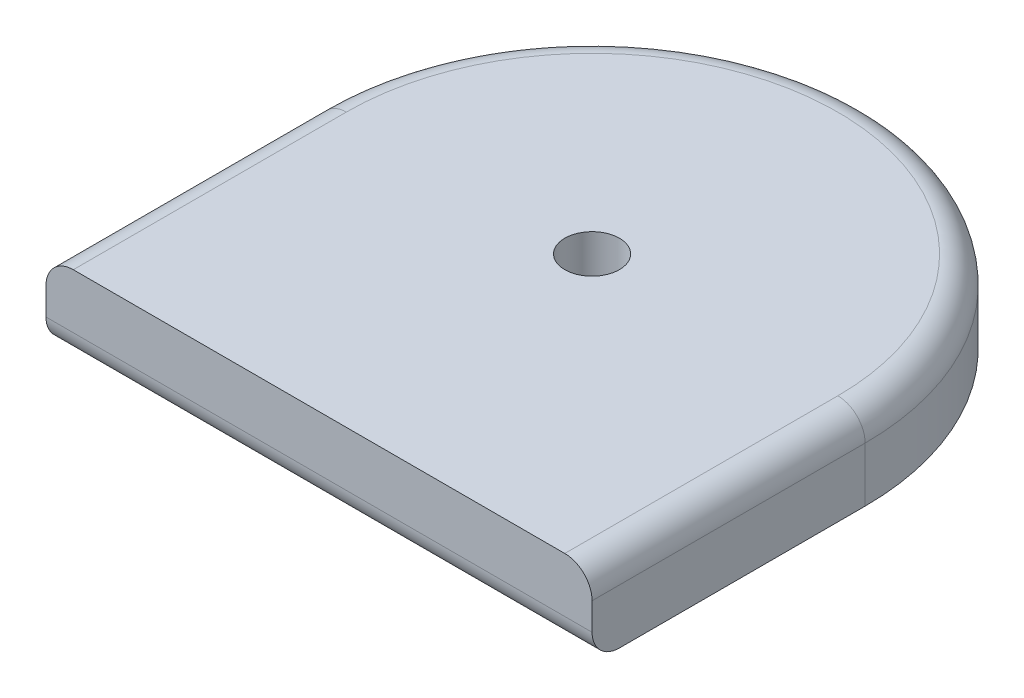
ISO-10303-21;
HEADER;
FILE_DESCRIPTION(('STEP AP214'),'2;1');
FILE_NAME('part.step','',(''),(''),'','','');
FILE_SCHEMA(('AUTOMOTIVE_DESIGN { 1 0 10303 214 1 1 1 1 }'));
ENDSEC;
DATA;
#1=APPLICATION_CONTEXT('core data for automotive mechanical design processes');
#2=APPLICATION_PROTOCOL_DEFINITION('international standard','automotive_design',2000,#1);
#3=PRODUCT_CONTEXT('',#1,'mechanical');
#4=PRODUCT('Part','Part','',(#3));
#5=PRODUCT_RELATED_PRODUCT_CATEGORY('part','',(#4));
#6=PRODUCT_DEFINITION_FORMATION('','',#4);
#7=PRODUCT_DEFINITION_CONTEXT('part definition',#1,'design');
#8=PRODUCT_DEFINITION('design','',#6,#7);
#9=PRODUCT_DEFINITION_SHAPE('','',#8);
#10=(LENGTH_UNIT() NAMED_UNIT(*) SI_UNIT(.MILLI.,.METRE.));
#11=(NAMED_UNIT(*) PLANE_ANGLE_UNIT() SI_UNIT($,.RADIAN.));
#12=(NAMED_UNIT(*) SI_UNIT($,.STERADIAN.) SOLID_ANGLE_UNIT());
#13=UNCERTAINTY_MEASURE_WITH_UNIT(LENGTH_MEASURE(1.E-05),#10,'distance_accuracy_value','');
#14=(GEOMETRIC_REPRESENTATION_CONTEXT(3) GLOBAL_UNCERTAINTY_ASSIGNED_CONTEXT((#13)) GLOBAL_UNIT_ASSIGNED_CONTEXT((#10,
#11,#12)) REPRESENTATION_CONTEXT('',''));
#15=CARTESIAN_POINT('',(0.,0.,0.));
#16=DIRECTION('',(0.,0.,1.));
#17=DIRECTION('',(1.,0.,0.));
#18=AXIS2_PLACEMENT_3D('',#15,#16,#17);
#19=CARTESIAN_POINT('',(0.,3.,0.));
#20=DIRECTION('',(0.,-1.,0.));
#21=DIRECTION('',(0.,0.,-1.));
#22=AXIS2_PLACEMENT_3D('',#19,#20,#21);
#23=CYLINDRICAL_SURFACE('',#22,10.);
#24=DIRECTION('',(0.,-1.,0.));
#25=VECTOR('',#24,1.);
#26=CARTESIAN_POINT('',(-10.,3.,0.));
#27=LINE('',#26,#25);
#28=CARTESIAN_POINT('',(-10.,2.,0.));
#29=VERTEX_POINT('',#28);
#30=CARTESIAN_POINT('',(-10.,0.,0.));
#31=VERTEX_POINT('',#30);
#32=EDGE_CURVE('E95',#29,#31,#27,.T.);
#33=ORIENTED_EDGE('',*,*,#32,.F.);
#34=CARTESIAN_POINT('',(0.,2.,0.));
#35=DIRECTION('',(0.,-1.,0.));
#36=DIRECTION('',(0.,0.,-1.));
#37=AXIS2_PLACEMENT_3D('',#34,#35,#36);
#38=CIRCLE('',#37,10.);
#39=CARTESIAN_POINT('',(10.,2.,0.));
#40=VERTEX_POINT('',#39);
#41=EDGE_CURVE('E11',#29,#40,#38,.T.);
#42=ORIENTED_EDGE('',*,*,#41,.T.);
#43=DIRECTION('',(0.,-1.,0.));
#44=VECTOR('',#43,1.);
#45=CARTESIAN_POINT('',(10.,3.,0.));
#46=LINE('',#45,#44);
#47=CARTESIAN_POINT('',(10.,0.,0.));
#48=VERTEX_POINT('',#47);
#49=EDGE_CURVE('E111',#40,#48,#46,.T.);
#50=ORIENTED_EDGE('',*,*,#49,.T.);
#51=CARTESIAN_POINT('',(0.,0.,0.));
#52=DIRECTION('',(0.,1.,0.));
#53=DIRECTION('',(0.,0.,-1.));
#54=AXIS2_PLACEMENT_3D('',#51,#52,#53);
#55=CIRCLE('',#54,10.);
#56=EDGE_CURVE('E107',#48,#31,#55,.T.);
#57=ORIENTED_EDGE('',*,*,#56,.T.);
#58=EDGE_LOOP('',(#33,#42,#50,#57));
#59=FACE_BOUND('',#58,.T.);
#60=ADVANCED_FACE('F36',(#59),#23,.T.);
#61=CARTESIAN_POINT('',(-10.,3.,0.));
#62=DIRECTION('',(1.,0.,0.));
#63=DIRECTION('',(0.,0.,-1.));
#64=AXIS2_PLACEMENT_3D('',#61,#62,#63);
#65=PLANE('',#64);
#66=DIRECTION('',(0.,-1.,0.));
#67=VECTOR('',#66,1.);
#68=CARTESIAN_POINT('',(-10.,3.,10.));
#69=LINE('',#68,#67);
#70=CARTESIAN_POINT('',(-10.,2.,10.));
#71=VERTEX_POINT('',#70);
#72=CARTESIAN_POINT('',(-10.,1.,10.));
#73=VERTEX_POINT('',#72);
#74=EDGE_CURVE('E103',#71,#73,#69,.T.);
#75=ORIENTED_EDGE('',*,*,#74,.F.);
#76=DIRECTION('',(0.,0.,1.));
#77=VECTOR('',#76,1.);
#78=CARTESIAN_POINT('',(-10.,2.,0.));
#79=LINE('',#78,#77);
#80=EDGE_CURVE('E53',#71,#29,#79,.F.);
#81=ORIENTED_EDGE('',*,*,#80,.T.);
#82=ORIENTED_EDGE('',*,*,#32,.T.);
#83=DIRECTION('',(0.,0.,1.));
#84=VECTOR('',#83,1.);
#85=CARTESIAN_POINT('',(-10.,0.,0.));
#86=LINE('',#85,#84);
#87=CARTESIAN_POINT('',(-10.,0.,9.));
#88=VERTEX_POINT('',#87);
#89=EDGE_CURVE('E97',#31,#88,#86,.T.);
#90=ORIENTED_EDGE('',*,*,#89,.T.);
#91=CARTESIAN_POINT('',(-10.,1.,9.));
#92=DIRECTION('',(1.,0.,0.));
#93=DIRECTION('',(0.,0.,-1.));
#94=AXIS2_PLACEMENT_3D('',#91,#92,#93);
#95=CIRCLE('',#94,1.);
#96=EDGE_CURVE('E146',#88,#73,#95,.F.);
#97=ORIENTED_EDGE('',*,*,#96,.T.);
#98=EDGE_LOOP('',(#75,#81,#82,#90,#97));
#99=FACE_BOUND('',#98,.T.);
#100=ADVANCED_FACE('F96',(#99),#65,.F.);
#101=CARTESIAN_POINT('',(-10.,3.,10.));
#102=DIRECTION('',(0.,0.,-1.));
#103=DIRECTION('',(-1.,0.,0.));
#104=AXIS2_PLACEMENT_3D('',#101,#102,#103);
#105=PLANE('',#104);
#106=DIRECTION('',(0.,-1.,0.));
#107=VECTOR('',#106,1.);
#108=CARTESIAN_POINT('',(10.,3.,10.));
#109=LINE('',#108,#107);
#110=CARTESIAN_POINT('',(10.,2.,10.));
#111=VERTEX_POINT('',#110);
#112=CARTESIAN_POINT('',(10.,1.,10.));
#113=VERTEX_POINT('',#112);
#114=EDGE_CURVE('E124',#111,#113,#109,.T.);
#115=ORIENTED_EDGE('',*,*,#114,.F.);
#116=CARTESIAN_POINT('',(9.,2.,10.));
#117=DIRECTION('',(0.,0.,-1.));
#118=DIRECTION('',(-1.,0.,0.));
#119=AXIS2_PLACEMENT_3D('',#116,#117,#118);
#120=CIRCLE('',#119,1.);
#121=CARTESIAN_POINT('',(9.,3.,10.));
#122=VERTEX_POINT('',#121);
#123=EDGE_CURVE('E144',#111,#122,#120,.F.);
#124=ORIENTED_EDGE('',*,*,#123,.T.);
#125=DIRECTION('',(1.,0.,0.));
#126=VECTOR('',#125,1.);
#127=CARTESIAN_POINT('',(-10.,3.,10.));
#128=LINE('',#127,#126);
#129=CARTESIAN_POINT('',(-9.,3.,10.));
#130=VERTEX_POINT('',#129);
#131=EDGE_CURVE('E119',#130,#122,#128,.T.);
#132=ORIENTED_EDGE('',*,*,#131,.F.);
#133=CARTESIAN_POINT('',(-9.,2.,10.));
#134=DIRECTION('',(0.,0.,-1.));
#135=DIRECTION('',(-1.,0.,0.));
#136=AXIS2_PLACEMENT_3D('',#133,#134,#135);
#137=CIRCLE('',#136,1.);
#138=EDGE_CURVE('E142',#130,#71,#137,.F.);
#139=ORIENTED_EDGE('',*,*,#138,.T.);
#140=ORIENTED_EDGE('',*,*,#74,.T.);
#141=DIRECTION('',(1.,0.,0.));
#142=VECTOR('',#141,1.);
#143=CARTESIAN_POINT('',(10.,1.,10.));
#144=LINE('',#143,#142);
#145=EDGE_CURVE('E139',#73,#113,#144,.T.);
#146=ORIENTED_EDGE('',*,*,#145,.T.);
#147=EDGE_LOOP('',(#115,#124,#132,#139,#140,#146));
#148=FACE_BOUND('',#147,.T.);
#149=ADVANCED_FACE('F174',(#148),#105,.F.);
#150=CARTESIAN_POINT('',(10.,3.,10.));
#151=DIRECTION('',(-1.,0.,0.));
#152=DIRECTION('',(0.,0.,1.));
#153=AXIS2_PLACEMENT_3D('',#150,#151,#152);
#154=PLANE('',#153);
#155=ORIENTED_EDGE('',*,*,#49,.F.);
#156=DIRECTION('',(0.,0.,-1.));
#157=VECTOR('',#156,1.);
#158=CARTESIAN_POINT('',(10.,2.,10.));
#159=LINE('',#158,#157);
#160=EDGE_CURVE('E137',#40,#111,#159,.F.);
#161=ORIENTED_EDGE('',*,*,#160,.T.);
#162=ORIENTED_EDGE('',*,*,#114,.T.);
#163=CARTESIAN_POINT('',(10.,1.,9.));
#164=DIRECTION('',(-1.,0.,0.));
#165=DIRECTION('',(0.,0.,1.));
#166=AXIS2_PLACEMENT_3D('',#163,#164,#165);
#167=CIRCLE('',#166,1.);
#168=CARTESIAN_POINT('',(10.,0.,9.));
#169=VERTEX_POINT('',#168);
#170=EDGE_CURVE('E135',#113,#169,#167,.F.);
#171=ORIENTED_EDGE('',*,*,#170,.T.);
#172=DIRECTION('',(0.,0.,-1.));
#173=VECTOR('',#172,1.);
#174=CARTESIAN_POINT('',(10.,0.,10.));
#175=LINE('',#174,#173);
#176=EDGE_CURVE('E108',#169,#48,#175,.T.);
#177=ORIENTED_EDGE('',*,*,#176,.T.);
#178=EDGE_LOOP('',(#155,#161,#162,#171,#177));
#179=FACE_BOUND('',#178,.T.);
#180=ADVANCED_FACE('F165',(#179),#154,.F.);
#181=CARTESIAN_POINT('',(0.,3.,0.));
#182=DIRECTION('',(0.,-1.,0.));
#183=DIRECTION('',(0.,0.,-1.));
#184=AXIS2_PLACEMENT_3D('',#181,#182,#183);
#185=PLANE('',#184);
#186=ORIENTED_EDGE('',*,*,#131,.T.);
#187=DIRECTION('',(0.,0.,-1.));
#188=VECTOR('',#187,1.);
#189=CARTESIAN_POINT('',(9.,3.,0.));
#190=LINE('',#189,#188);
#191=CARTESIAN_POINT('',(9.,3.,0.));
#192=VERTEX_POINT('',#191);
#193=EDGE_CURVE('E132',#122,#192,#190,.T.);
#194=ORIENTED_EDGE('',*,*,#193,.T.);
#195=CARTESIAN_POINT('',(0.,3.,0.));
#196=DIRECTION('',(0.,-1.,0.));
#197=DIRECTION('',(0.,0.,-1.));
#198=AXIS2_PLACEMENT_3D('',#195,#196,#197);
#199=CIRCLE('',#198,9.);
#200=CARTESIAN_POINT('',(-9.,3.,0.));
#201=VERTEX_POINT('',#200);
#202=EDGE_CURVE('E102',#192,#201,#199,.F.);
#203=ORIENTED_EDGE('',*,*,#202,.T.);
#204=DIRECTION('',(0.,0.,1.));
#205=VECTOR('',#204,1.);
#206=CARTESIAN_POINT('',(-9.,3.,0.));
#207=LINE('',#206,#205);
#208=EDGE_CURVE('E130',#201,#130,#207,.T.);
#209=ORIENTED_EDGE('',*,*,#208,.T.);
#210=EDGE_LOOP('',(#186,#194,#203,#209));
#211=FACE_BOUND('',#210,.T.);
#212=CARTESIAN_POINT('',(0.,3.,0.));
#213=DIRECTION('',(0.,1.,0.));
#214=DIRECTION('',(0.,0.,1.));
#215=AXIS2_PLACEMENT_3D('',#212,#213,#214);
#216=CIRCLE('',#215,1.);
#217=CARTESIAN_POINT('',(0.,3.,1.));
#218=VERTEX_POINT('',#217);
#219=EDGE_CURVE('E116',#218,#218,#216,.T.);
#220=ORIENTED_EDGE('',*,*,#219,.F.);
#221=EDGE_LOOP('',(#220));
#222=FACE_BOUND('',#221,.T.);
#223=ADVANCED_FACE('F163',(#211,#222),#185,.F.);
#224=CARTESIAN_POINT('',(0.,0.,0.));
#225=DIRECTION('',(0.,-1.,0.));
#226=DIRECTION('',(0.,0.,-1.));
#227=AXIS2_PLACEMENT_3D('',#224,#225,#226);
#228=PLANE('',#227);
#229=CARTESIAN_POINT('',(0.,0.,0.));
#230=DIRECTION('',(0.,1.,0.));
#231=DIRECTION('',(0.,0.,1.));
#232=AXIS2_PLACEMENT_3D('',#229,#230,#231);
#233=CIRCLE('',#232,1.);
#234=CARTESIAN_POINT('',(0.,0.,1.));
#235=VERTEX_POINT('',#234);
#236=EDGE_CURVE('E113',#235,#235,#233,.T.);
#237=ORIENTED_EDGE('',*,*,#236,.T.);
#238=EDGE_LOOP('',(#237));
#239=FACE_BOUND('',#238,.T.);
#240=ORIENTED_EDGE('',*,*,#176,.F.);
#241=DIRECTION('',(1.,0.,0.));
#242=VECTOR('',#241,1.);
#243=CARTESIAN_POINT('',(-10.,0.,9.));
#244=LINE('',#243,#242);
#245=EDGE_CURVE('E45',#169,#88,#244,.F.);
#246=ORIENTED_EDGE('',*,*,#245,.T.);
#247=ORIENTED_EDGE('',*,*,#89,.F.);
#248=ORIENTED_EDGE('',*,*,#56,.F.);
#249=EDGE_LOOP('',(#240,#246,#247,#248));
#250=FACE_BOUND('',#249,.T.);
#251=ADVANCED_FACE('F106',(#239,#250),#228,.T.);
#252=CARTESIAN_POINT('',(0.,0.,0.));
#253=DIRECTION('',(0.,1.,0.));
#254=DIRECTION('',(0.,0.,1.));
#255=AXIS2_PLACEMENT_3D('',#252,#253,#254);
#256=CYLINDRICAL_SURFACE('',#255,1.);
#257=ORIENTED_EDGE('',*,*,#236,.F.);
#258=EDGE_LOOP('',(#257));
#259=FACE_BOUND('',#258,.T.);
#260=ORIENTED_EDGE('',*,*,#219,.T.);
#261=EDGE_LOOP('',(#260));
#262=FACE_BOUND('',#261,.T.);
#263=ADVANCED_FACE('F161',(#259,#262),#256,.F.);
#264=CARTESIAN_POINT('',(-9.,2.,0.));
#265=DIRECTION('',(0.,0.,1.));
#266=DIRECTION('',(1.,0.,0.));
#267=AXIS2_PLACEMENT_3D('',#264,#265,#266);
#268=CYLINDRICAL_SURFACE('',#267,1.);
#269=ORIENTED_EDGE('',*,*,#138,.F.);
#270=ORIENTED_EDGE('',*,*,#208,.F.);
#271=CARTESIAN_POINT('',(-9.,2.,0.));
#272=DIRECTION('',(0.,0.,-1.));
#273=DIRECTION('',(-1.,0.,0.));
#274=AXIS2_PLACEMENT_3D('',#271,#272,#273);
#275=CIRCLE('',#274,1.);
#276=EDGE_CURVE('E40',#29,#201,#275,.T.);
#277=ORIENTED_EDGE('',*,*,#276,.F.);
#278=ORIENTED_EDGE('',*,*,#80,.F.);
#279=EDGE_LOOP('',(#269,#270,#277,#278));
#280=FACE_BOUND('',#279,.T.);
#281=ADVANCED_FACE('F192',(#280),#268,.T.);
#282=CARTESIAN_POINT('',(0.,2.,0.));
#283=DIRECTION('',(0.,-1.,0.));
#284=DIRECTION('',(0.,0.,-1.));
#285=AXIS2_PLACEMENT_3D('',#282,#283,#284);
#286=TOROIDAL_SURFACE('',#285,9.,1.);
#287=ORIENTED_EDGE('',*,*,#276,.T.);
#288=ORIENTED_EDGE('',*,*,#202,.F.);
#289=CARTESIAN_POINT('',(9.,2.,0.));
#290=DIRECTION('',(0.,0.,1.));
#291=DIRECTION('',(1.,0.,0.));
#292=AXIS2_PLACEMENT_3D('',#289,#290,#291);
#293=CIRCLE('',#292,1.);
#294=EDGE_CURVE('E149',#40,#192,#293,.T.);
#295=ORIENTED_EDGE('',*,*,#294,.F.);
#296=ORIENTED_EDGE('',*,*,#41,.F.);
#297=EDGE_LOOP('',(#287,#288,#295,#296));
#298=FACE_BOUND('',#297,.T.);
#299=ADVANCED_FACE('F190',(#298),#286,.T.);
#300=CARTESIAN_POINT('',(9.,2.,0.));
#301=DIRECTION('',(0.,0.,-1.));
#302=DIRECTION('',(-1.,0.,0.));
#303=AXIS2_PLACEMENT_3D('',#300,#301,#302);
#304=CYLINDRICAL_SURFACE('',#303,1.);
#305=ORIENTED_EDGE('',*,*,#123,.F.);
#306=ORIENTED_EDGE('',*,*,#160,.F.);
#307=ORIENTED_EDGE('',*,*,#294,.T.);
#308=ORIENTED_EDGE('',*,*,#193,.F.);
#309=EDGE_LOOP('',(#305,#306,#307,#308));
#310=FACE_BOUND('',#309,.T.);
#311=ADVANCED_FACE('F187',(#310),#304,.T.);
#312=CARTESIAN_POINT('',(-10.,1.,9.));
#313=DIRECTION('',(-1.,0.,0.));
#314=DIRECTION('',(0.,0.,1.));
#315=AXIS2_PLACEMENT_3D('',#312,#313,#314);
#316=CYLINDRICAL_SURFACE('',#315,1.);
#317=ORIENTED_EDGE('',*,*,#96,.F.);
#318=ORIENTED_EDGE('',*,*,#245,.F.);
#319=ORIENTED_EDGE('',*,*,#170,.F.);
#320=ORIENTED_EDGE('',*,*,#145,.F.);
#321=EDGE_LOOP('',(#317,#318,#319,#320));
#322=FACE_BOUND('',#321,.T.);
#323=ADVANCED_FACE('F38',(#322),#316,.T.);
#324=CLOSED_SHELL('',(#60,#100,#149,#180,#223,#251,#263,#281,#299,#311,#323));
#325=MANIFOLD_SOLID_BREP('B2',#324);
#326=ADVANCED_BREP_SHAPE_REPRESENTATION('',(#18,#325),#14);
#327=SHAPE_DEFINITION_REPRESENTATION(#9,#326);
ENDSEC;
END-ISO-10303-21;
